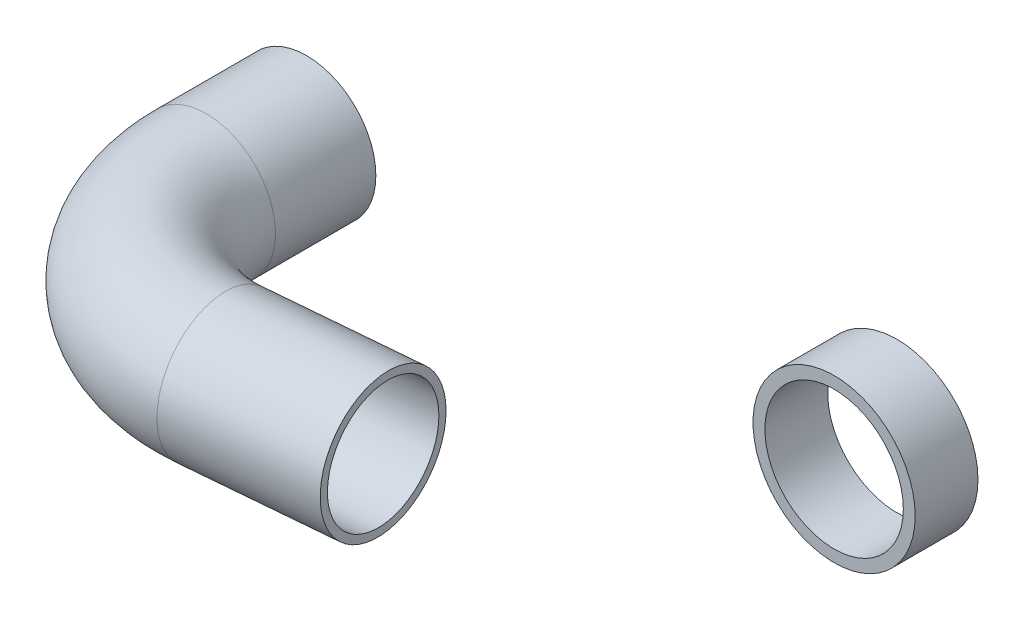
ISO-10303-21;
HEADER;
FILE_DESCRIPTION(('STEP AP214'),'2;1');
FILE_NAME('part.step','',(''),(''),'','','');
FILE_SCHEMA(('AUTOMOTIVE_DESIGN { 1 0 10303 214 1 1 1 1 }'));
ENDSEC;
DATA;
#1=APPLICATION_CONTEXT('core data for automotive mechanical design processes');
#2=APPLICATION_PROTOCOL_DEFINITION('international standard','automotive_design',2000,#1);
#3=PRODUCT_CONTEXT('',#1,'mechanical');
#4=PRODUCT('Part','Part','',(#3));
#5=PRODUCT_RELATED_PRODUCT_CATEGORY('part','',(#4));
#6=PRODUCT_DEFINITION_FORMATION('','',#4);
#7=PRODUCT_DEFINITION_CONTEXT('part definition',#1,'design');
#8=PRODUCT_DEFINITION('design','',#6,#7);
#9=PRODUCT_DEFINITION_SHAPE('','',#8);
#10=(LENGTH_UNIT() NAMED_UNIT(*) SI_UNIT(.MILLI.,.METRE.));
#11=(NAMED_UNIT(*) PLANE_ANGLE_UNIT() SI_UNIT($,.RADIAN.));
#12=(NAMED_UNIT(*) SI_UNIT($,.STERADIAN.) SOLID_ANGLE_UNIT());
#13=UNCERTAINTY_MEASURE_WITH_UNIT(LENGTH_MEASURE(1.E-05),#10,'distance_accuracy_value','');
#14=(GEOMETRIC_REPRESENTATION_CONTEXT(3) GLOBAL_UNCERTAINTY_ASSIGNED_CONTEXT((#13)) GLOBAL_UNIT_ASSIGNED_CONTEXT((#10,
#11,#12)) REPRESENTATION_CONTEXT('',''));
#15=CARTESIAN_POINT('',(0.,0.,0.));
#16=DIRECTION('',(0.,0.,1.));
#17=DIRECTION('',(1.,0.,0.));
#18=AXIS2_PLACEMENT_3D('',#15,#16,#17);
#19=CARTESIAN_POINT('',(-98.2793662013141,0.,72.8800179972955));
#20=DIRECTION('',(0.996194698091745,0.,-0.087155742747661));
#21=DIRECTION('',(-0.087155742747661,0.,-0.996194698091745));
#22=AXIS2_PLACEMENT_3D('',#19,#20,#21);
#23=CYLINDRICAL_SURFACE('',#22,17.5);
#24=CARTESIAN_POINT('',(-98.2793662013141,0.,72.8800179972955));
#25=DIRECTION('',(0.996194698091745,0.,-0.0871557427476616));
#26=DIRECTION('',(-0.0871557427476616,0.,-0.996194698091745));
#27=AXIS2_PLACEMENT_3D('',#24,#25,#26);
#28=CIRCLE('',#27,17.5);
#29=CARTESIAN_POINT('',(-96.75414070323,0.,90.3134252139011));
#30=VERTEX_POINT('',#29);
#31=EDGE_CURVE('E54',#30,#30,#28,.T.);
#32=ORIENTED_EDGE('',*,*,#31,.T.);
#33=EDGE_LOOP('',(#32));
#34=FACE_BOUND('',#33,.T.);
#35=CARTESIAN_POINT('',(-60.3243482040186,0.,69.5593841986096));
#36=DIRECTION('',(0.996194698091745,0.,-0.0871557427476616));
#37=DIRECTION('',(-0.0871557427476616,0.,-0.996194698091745));
#38=AXIS2_PLACEMENT_3D('',#35,#36,#37);
#39=CIRCLE('',#38,17.5);
#40=CARTESIAN_POINT('',(-61.8495737021027,0.,52.125976982004));
#41=VERTEX_POINT('',#40);
#42=EDGE_CURVE('E11',#41,#41,#39,.T.);
#43=ORIENTED_EDGE('',*,*,#42,.F.);
#44=EDGE_LOOP('',(#43));
#45=FACE_BOUND('',#44,.T.);
#46=ADVANCED_FACE('F44',(#34,#45),#23,.T.);
#47=CARTESIAN_POINT('',(-98.2793662013141,0.,72.8800179972955));
#48=DIRECTION('',(0.996194698091745,0.,-0.087155742747661));
#49=DIRECTION('',(-0.087155742747661,0.,-0.996194698091745));
#50=AXIS2_PLACEMENT_3D('',#47,#48,#49);
#51=CYLINDRICAL_SURFACE('',#50,15.5);
#52=CARTESIAN_POINT('',(-98.2793662013141,0.,72.8800179972955));
#53=DIRECTION('',(0.996194698091745,0.,-0.0871557427476616));
#54=DIRECTION('',(-0.0871557427476616,0.,-0.996194698091745));
#55=AXIS2_PLACEMENT_3D('',#52,#53,#54);
#56=CIRCLE('',#55,15.5);
#57=CARTESIAN_POINT('',(-96.9284521887253,0.,88.3210358177176));
#58=VERTEX_POINT('',#57);
#59=EDGE_CURVE('E58',#58,#58,#56,.T.);
#60=ORIENTED_EDGE('',*,*,#59,.F.);
#61=EDGE_LOOP('',(#60));
#62=FACE_BOUND('',#61,.T.);
#63=CARTESIAN_POINT('',(-60.3243482040186,0.,69.5593841986096));
#64=DIRECTION('',(0.996194698091745,0.,-0.0871557427476616));
#65=DIRECTION('',(-0.0871557427476616,0.,-0.996194698091745));
#66=AXIS2_PLACEMENT_3D('',#63,#64,#65);
#67=CIRCLE('',#66,15.5);
#68=CARTESIAN_POINT('',(-61.6752622166073,0.,54.1183663781876));
#69=VERTEX_POINT('',#68);
#70=EDGE_CURVE('E50',#69,#69,#67,.T.);
#71=ORIENTED_EDGE('',*,*,#70,.T.);
#72=EDGE_LOOP('',(#71));
#73=FACE_BOUND('',#72,.T.);
#74=ADVANCED_FACE('F86',(#62,#73),#51,.F.);
#75=CARTESIAN_POINT('',(-101.6,0.,34.925));
#76=DIRECTION('',(0.,1.,0.));
#77=DIRECTION('',(0.,0.,1.));
#78=AXIS2_PLACEMENT_3D('',#75,#76,#77);
#79=TOROIDAL_SURFACE('',#78,38.1,17.5);
#80=CARTESIAN_POINT('',(-139.7,0.,34.925));
#81=DIRECTION('',(0.,0.,1.));
#82=DIRECTION('',(1.,0.,0.));
#83=AXIS2_PLACEMENT_3D('',#80,#81,#82);
#84=CIRCLE('',#83,17.5);
#85=CARTESIAN_POINT('',(-157.2,0.,34.925));
#86=VERTEX_POINT('',#85);
#87=EDGE_CURVE('E63',#86,#86,#84,.T.);
#88=CARTESIAN_POINT('',(-101.6,0.,34.925));
#89=DIRECTION('',(0.,1.,0.));
#90=DIRECTION('',(0.,0.,1.));
#91=AXIS2_PLACEMENT_3D('',#88,#89,#90);
#92=CIRCLE('',#91,55.6);
#93=EDGE_CURVE('',#86,#30,#92,.T.);
#94=ORIENTED_EDGE('',*,*,#87,.T.);
#95=ORIENTED_EDGE('',*,*,#31,.F.);
#96=ORIENTED_EDGE('',*,*,#93,.T.);
#97=ORIENTED_EDGE('',*,*,#93,.F.);
#98=EDGE_LOOP('',(#94,#96,#95,#97));
#99=FACE_BOUND('',#98,.T.);
#100=ADVANCED_FACE('F82',(#99),#79,.T.);
#101=CARTESIAN_POINT('',(-101.6,0.,34.925));
#102=DIRECTION('',(0.,1.,0.));
#103=DIRECTION('',(0.,0.,1.));
#104=AXIS2_PLACEMENT_3D('',#101,#102,#103);
#105=TOROIDAL_SURFACE('',#104,38.1,15.5);
#106=CARTESIAN_POINT('',(-139.7,0.,34.925));
#107=DIRECTION('',(0.,0.,1.));
#108=DIRECTION('',(1.,0.,0.));
#109=AXIS2_PLACEMENT_3D('',#106,#107,#108);
#110=CIRCLE('',#109,15.5);
#111=CARTESIAN_POINT('',(-155.2,0.,34.925));
#112=VERTEX_POINT('',#111);
#113=EDGE_CURVE('E67',#112,#112,#110,.T.);
#114=CARTESIAN_POINT('',(-101.6,0.,34.925));
#115=DIRECTION('',(0.,1.,0.));
#116=DIRECTION('',(0.,0.,1.));
#117=AXIS2_PLACEMENT_3D('',#114,#115,#116);
#118=CIRCLE('',#117,53.6);
#119=EDGE_CURVE('',#112,#58,#118,.T.);
#120=ORIENTED_EDGE('',*,*,#113,.F.);
#121=ORIENTED_EDGE('',*,*,#59,.T.);
#122=ORIENTED_EDGE('',*,*,#119,.T.);
#123=ORIENTED_EDGE('',*,*,#119,.F.);
#124=EDGE_LOOP('',(#120,#122,#121,#123));
#125=FACE_BOUND('',#124,.T.);
#126=ADVANCED_FACE('F79',(#125),#105,.F.);
#127=CARTESIAN_POINT('',(-139.7,0.,34.925));
#128=DIRECTION('',(0.,0.,-1.));
#129=DIRECTION('',(-1.,0.,0.));
#130=AXIS2_PLACEMENT_3D('',#127,#128,#129);
#131=CYLINDRICAL_SURFACE('',#130,15.5);
#132=ORIENTED_EDGE('',*,*,#113,.T.);
#133=EDGE_LOOP('',(#132));
#134=FACE_BOUND('',#133,.T.);
#135=CARTESIAN_POINT('',(-139.7,0.,9.525));
#136=DIRECTION('',(0.,0.,1.));
#137=DIRECTION('',(1.,0.,0.));
#138=AXIS2_PLACEMENT_3D('',#135,#136,#137);
#139=CIRCLE('',#138,15.5);
#140=CARTESIAN_POINT('',(-124.2,0.,9.525));
#141=VERTEX_POINT('',#140);
#142=EDGE_CURVE('E68',#141,#141,#139,.T.);
#143=ORIENTED_EDGE('',*,*,#142,.F.);
#144=EDGE_LOOP('',(#143));
#145=FACE_BOUND('',#144,.T.);
#146=ADVANCED_FACE('F76',(#134,#145),#131,.F.);
#147=CARTESIAN_POINT('',(-139.7,0.,34.925));
#148=DIRECTION('',(0.,0.,-1.));
#149=DIRECTION('',(-1.,0.,0.));
#150=AXIS2_PLACEMENT_3D('',#147,#148,#149);
#151=CYLINDRICAL_SURFACE('',#150,17.5);
#152=ORIENTED_EDGE('',*,*,#87,.F.);
#153=EDGE_LOOP('',(#152));
#154=FACE_BOUND('',#153,.T.);
#155=CARTESIAN_POINT('',(-139.7,0.,9.525));
#156=DIRECTION('',(0.,0.,1.));
#157=DIRECTION('',(1.,0.,0.));
#158=AXIS2_PLACEMENT_3D('',#155,#156,#157);
#159=CIRCLE('',#158,17.5);
#160=CARTESIAN_POINT('',(-122.2,0.,9.525));
#161=VERTEX_POINT('',#160);
#162=EDGE_CURVE('E64',#161,#161,#159,.T.);
#163=ORIENTED_EDGE('',*,*,#162,.T.);
#164=EDGE_LOOP('',(#163));
#165=FACE_BOUND('',#164,.T.);
#166=ADVANCED_FACE('F98',(#154,#165),#151,.T.);
#167=CARTESIAN_POINT('',(-60.3243482040186,0.,69.5593841986096));
#168=DIRECTION('',(0.996194698091745,0.,-0.0871557427476616));
#169=DIRECTION('',(-0.0871557427476616,0.,-0.996194698091745));
#170=AXIS2_PLACEMENT_3D('',#167,#168,#169);
#171=PLANE('',#170);
#172=ORIENTED_EDGE('',*,*,#70,.F.);
#173=EDGE_LOOP('',(#172));
#174=FACE_BOUND('',#173,.T.);
#175=ORIENTED_EDGE('',*,*,#42,.T.);
#176=EDGE_LOOP('',(#175));
#177=FACE_BOUND('',#176,.T.);
#178=ADVANCED_FACE('F101',(#174,#177),#171,.T.);
#179=CARTESIAN_POINT('',(-139.7,0.,9.525));
#180=DIRECTION('',(0.,0.,1.));
#181=DIRECTION('',(1.,0.,0.));
#182=AXIS2_PLACEMENT_3D('',#179,#180,#181);
#183=PLANE('',#182);
#184=ORIENTED_EDGE('',*,*,#142,.T.);
#185=EDGE_LOOP('',(#184));
#186=FACE_BOUND('',#185,.T.);
#187=ORIENTED_EDGE('',*,*,#162,.F.);
#188=EDGE_LOOP('',(#187));
#189=FACE_BOUND('',#188,.T.);
#190=ADVANCED_FACE('F103',(#186,#189),#183,.F.);
#191=CLOSED_SHELL('',(#46,#74,#100,#126,#146,#166,#178,#190));
#192=MANIFOLD_SOLID_BREP('B2',#191);
#193=CARTESIAN_POINT('',(0.,0.,15.875));
#194=DIRECTION('',(0.,0.,1.));
#195=DIRECTION('',(1.,0.,0.));
#196=AXIS2_PLACEMENT_3D('',#193,#194,#195);
#197=PLANE('',#196);
#198=CARTESIAN_POINT('',(0.,0.,15.875));
#199=DIRECTION('',(0.,0.,1.));
#200=DIRECTION('',(1.,0.,0.));
#201=AXIS2_PLACEMENT_3D('',#198,#199,#200);
#202=CIRCLE('',#201,20.5);
#203=CARTESIAN_POINT('',(20.5,0.,15.875));
#204=VERTEX_POINT('',#203);
#205=EDGE_CURVE('E43',#204,#204,#202,.T.);
#206=ORIENTED_EDGE('',*,*,#205,.T.);
#207=EDGE_LOOP('',(#206));
#208=FACE_BOUND('',#207,.T.);
#209=CARTESIAN_POINT('',(0.,0.,15.875));
#210=DIRECTION('',(0.,0.,1.));
#211=DIRECTION('',(1.,0.,0.));
#212=AXIS2_PLACEMENT_3D('',#209,#210,#211);
#213=CIRCLE('',#212,17.5);
#214=CARTESIAN_POINT('',(17.5,0.,15.875));
#215=VERTEX_POINT('',#214);
#216=EDGE_CURVE('E176',#215,#215,#213,.T.);
#217=ORIENTED_EDGE('',*,*,#216,.F.);
#218=EDGE_LOOP('',(#217));
#219=FACE_BOUND('',#218,.T.);
#220=ADVANCED_FACE('F165',(#208,#219),#197,.T.);
#221=CARTESIAN_POINT('',(0.,0.,0.));
#222=DIRECTION('',(0.,0.,1.));
#223=DIRECTION('',(1.,0.,0.));
#224=AXIS2_PLACEMENT_3D('',#221,#222,#223);
#225=PLANE('',#224);
#226=CARTESIAN_POINT('',(0.,0.,0.));
#227=DIRECTION('',(0.,0.,1.));
#228=DIRECTION('',(1.,0.,0.));
#229=AXIS2_PLACEMENT_3D('',#226,#227,#228);
#230=CIRCLE('',#229,20.5);
#231=CARTESIAN_POINT('',(20.5,0.,0.));
#232=VERTEX_POINT('',#231);
#233=EDGE_CURVE('E169',#232,#232,#230,.T.);
#234=ORIENTED_EDGE('',*,*,#233,.F.);
#235=EDGE_LOOP('',(#234));
#236=FACE_BOUND('',#235,.T.);
#237=CARTESIAN_POINT('',(0.,0.,0.));
#238=DIRECTION('',(0.,0.,1.));
#239=DIRECTION('',(1.,0.,0.));
#240=AXIS2_PLACEMENT_3D('',#237,#238,#239);
#241=CIRCLE('',#240,17.5);
#242=CARTESIAN_POINT('',(17.5,0.,0.));
#243=VERTEX_POINT('',#242);
#244=EDGE_CURVE('E178',#243,#243,#241,.T.);
#245=ORIENTED_EDGE('',*,*,#244,.T.);
#246=EDGE_LOOP('',(#245));
#247=FACE_BOUND('',#246,.T.);
#248=ADVANCED_FACE('F188',(#236,#247),#225,.F.);
#249=CARTESIAN_POINT('',(0.,0.,15.875));
#250=DIRECTION('',(0.,0.,-1.));
#251=DIRECTION('',(-1.,0.,0.));
#252=AXIS2_PLACEMENT_3D('',#249,#250,#251);
#253=CYLINDRICAL_SURFACE('',#252,20.5);
#254=ORIENTED_EDGE('',*,*,#205,.F.);
#255=EDGE_LOOP('',(#254));
#256=FACE_BOUND('',#255,.T.);
#257=ORIENTED_EDGE('',*,*,#233,.T.);
#258=EDGE_LOOP('',(#257));
#259=FACE_BOUND('',#258,.T.);
#260=ADVANCED_FACE('F167',(#256,#259),#253,.T.);
#261=CARTESIAN_POINT('',(0.,0.,15.875));
#262=DIRECTION('',(0.,0.,-1.));
#263=DIRECTION('',(-1.,0.,0.));
#264=AXIS2_PLACEMENT_3D('',#261,#262,#263);
#265=CYLINDRICAL_SURFACE('',#264,17.5);
#266=ORIENTED_EDGE('',*,*,#216,.T.);
#267=EDGE_LOOP('',(#266));
#268=FACE_BOUND('',#267,.T.);
#269=ORIENTED_EDGE('',*,*,#244,.F.);
#270=EDGE_LOOP('',(#269));
#271=FACE_BOUND('',#270,.T.);
#272=ADVANCED_FACE('F184',(#268,#271),#265,.F.);
#273=CLOSED_SHELL('',(#220,#248,#260,#272));
#274=MANIFOLD_SOLID_BREP('B6_NOT_SHOWN',#273);
#275=ADVANCED_BREP_SHAPE_REPRESENTATION('',(#18,#192,#274),#14);
#276=SHAPE_DEFINITION_REPRESENTATION(#9,#275);
ENDSEC;
END-ISO-10303-21;
